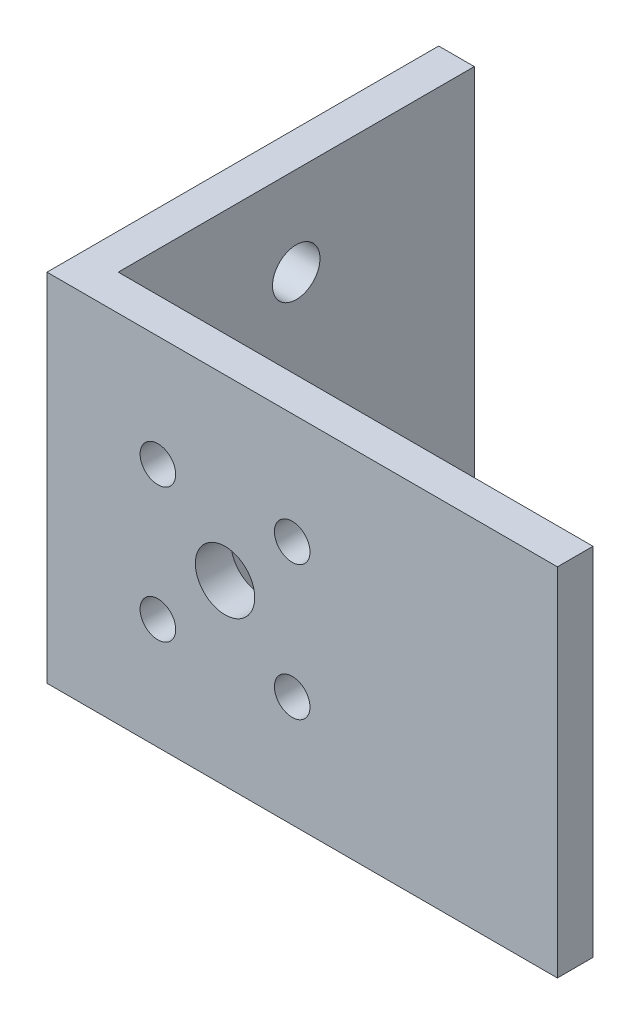
ISO-10303-21;
HEADER;
FILE_DESCRIPTION(('STEP AP214'),'2;1');
FILE_NAME('part.step','',(''),(''),'','','');
FILE_SCHEMA(('AUTOMOTIVE_DESIGN { 1 0 10303 214 1 1 1 1 }'));
ENDSEC;
DATA;
#1=APPLICATION_CONTEXT('core data for automotive mechanical design processes');
#2=APPLICATION_PROTOCOL_DEFINITION('international standard','automotive_design',2000,#1);
#3=PRODUCT_CONTEXT('',#1,'mechanical');
#4=PRODUCT('Part','Part','',(#3));
#5=PRODUCT_RELATED_PRODUCT_CATEGORY('part','',(#4));
#6=PRODUCT_DEFINITION_FORMATION('','',#4);
#7=PRODUCT_DEFINITION_CONTEXT('part definition',#1,'design');
#8=PRODUCT_DEFINITION('design','',#6,#7);
#9=PRODUCT_DEFINITION_SHAPE('','',#8);
#10=(LENGTH_UNIT() NAMED_UNIT(*) SI_UNIT(.MILLI.,.METRE.));
#11=(NAMED_UNIT(*) PLANE_ANGLE_UNIT() SI_UNIT($,.RADIAN.));
#12=(NAMED_UNIT(*) SI_UNIT($,.STERADIAN.) SOLID_ANGLE_UNIT());
#13=UNCERTAINTY_MEASURE_WITH_UNIT(LENGTH_MEASURE(1.E-05),#10,'distance_accuracy_value','');
#14=(GEOMETRIC_REPRESENTATION_CONTEXT(3) GLOBAL_UNCERTAINTY_ASSIGNED_CONTEXT((#13)) GLOBAL_UNIT_ASSIGNED_CONTEXT((#10,
#11,#12)) REPRESENTATION_CONTEXT('',''));
#15=CARTESIAN_POINT('',(0.,0.,0.));
#16=DIRECTION('',(0.,0.,1.));
#17=DIRECTION('',(1.,0.,0.));
#18=AXIS2_PLACEMENT_3D('',#15,#16,#17);
#19=CARTESIAN_POINT('',(0.,30.,-33.));
#20=DIRECTION('',(1.,0.,0.));
#21=DIRECTION('',(0.,0.,-1.));
#22=AXIS2_PLACEMENT_3D('',#19,#20,#21);
#23=PLANE('',#22);
#24=CARTESIAN_POINT('',(0.,22.5,-18.));
#25=DIRECTION('',(-1.,0.,0.));
#26=DIRECTION('',(0.,0.,1.));
#27=AXIS2_PLACEMENT_3D('',#24,#25,#26);
#28=CIRCLE('',#27,2.);
#29=CARTESIAN_POINT('',(0.,22.5,-16.));
#30=VERTEX_POINT('',#29);
#31=EDGE_CURVE('E164',#30,#30,#28,.T.);
#32=ORIENTED_EDGE('',*,*,#31,.F.);
#33=EDGE_LOOP('',(#32));
#34=FACE_BOUND('',#33,.T.);
#35=CARTESIAN_POINT('',(0.,7.5,-18.));
#36=DIRECTION('',(-1.,0.,0.));
#37=DIRECTION('',(0.,0.,1.));
#38=AXIS2_PLACEMENT_3D('',#35,#36,#37);
#39=CIRCLE('',#38,2.);
#40=CARTESIAN_POINT('',(0.,7.5,-16.));
#41=VERTEX_POINT('',#40);
#42=EDGE_CURVE('E167',#41,#41,#39,.T.);
#43=ORIENTED_EDGE('',*,*,#42,.F.);
#44=EDGE_LOOP('',(#43));
#45=FACE_BOUND('',#44,.T.);
#46=DIRECTION('',(0.,0.,1.));
#47=VECTOR('',#46,1.);
#48=CARTESIAN_POINT('',(0.,0.,-33.));
#49=LINE('',#48,#47);
#50=CARTESIAN_POINT('',(0.,0.,-33.));
#51=VERTEX_POINT('',#50);
#52=CARTESIAN_POINT('',(0.,0.,0.));
#53=VERTEX_POINT('',#52);
#54=EDGE_CURVE('E119',#51,#53,#49,.T.);
#55=ORIENTED_EDGE('',*,*,#54,.T.);
#56=DIRECTION('',(0.,-1.,0.));
#57=VECTOR('',#56,1.);
#58=CARTESIAN_POINT('',(0.,30.,0.));
#59=LINE('',#58,#57);
#60=CARTESIAN_POINT('',(0.,30.,0.));
#61=VERTEX_POINT('',#60);
#62=EDGE_CURVE('E11',#61,#53,#59,.T.);
#63=ORIENTED_EDGE('',*,*,#62,.F.);
#64=DIRECTION('',(0.,0.,1.));
#65=VECTOR('',#64,1.);
#66=CARTESIAN_POINT('',(0.,30.,-33.));
#67=LINE('',#66,#65);
#68=CARTESIAN_POINT('',(0.,30.,-33.));
#69=VERTEX_POINT('',#68);
#70=EDGE_CURVE('E130',#69,#61,#67,.T.);
#71=ORIENTED_EDGE('',*,*,#70,.F.);
#72=DIRECTION('',(0.,-1.,0.));
#73=VECTOR('',#72,1.);
#74=CARTESIAN_POINT('',(0.,30.,-33.));
#75=LINE('',#74,#73);
#76=EDGE_CURVE('E115',#69,#51,#75,.T.);
#77=ORIENTED_EDGE('',*,*,#76,.T.);
#78=EDGE_LOOP('',(#55,#63,#71,#77));
#79=FACE_BOUND('',#78,.T.);
#80=ADVANCED_FACE('F35',(#34,#45,#79),#23,.F.);
#81=CARTESIAN_POINT('',(0.,30.,0.));
#82=DIRECTION('',(0.,0.,-1.));
#83=DIRECTION('',(-1.,0.,0.));
#84=AXIS2_PLACEMENT_3D('',#81,#82,#83);
#85=PLANE('',#84);
#86=CARTESIAN_POINT('',(9.34314575050763,20.6568542494924,0.));
#87=DIRECTION('',(0.,0.,-1.));
#88=DIRECTION('',(-1.,0.,0.));
#89=AXIS2_PLACEMENT_3D('',#86,#87,#88);
#90=CIRCLE('',#89,1.5);
#91=CARTESIAN_POINT('',(7.84314575050762,20.6568542494924,0.));
#92=VERTEX_POINT('',#91);
#93=EDGE_CURVE('E203',#92,#92,#90,.F.);
#94=ORIENTED_EDGE('',*,*,#93,.F.);
#95=EDGE_LOOP('',(#94));
#96=FACE_BOUND('',#95,.T.);
#97=CARTESIAN_POINT('',(20.6568542494924,20.6568542494924,0.));
#98=DIRECTION('',(0.,0.,-1.));
#99=DIRECTION('',(-1.,0.,0.));
#100=AXIS2_PLACEMENT_3D('',#97,#98,#99);
#101=CIRCLE('',#100,1.50000000000001);
#102=CARTESIAN_POINT('',(19.1568542494924,20.6568542494924,0.));
#103=VERTEX_POINT('',#102);
#104=EDGE_CURVE('E197',#103,#103,#101,.F.);
#105=ORIENTED_EDGE('',*,*,#104,.F.);
#106=EDGE_LOOP('',(#105));
#107=FACE_BOUND('',#106,.T.);
#108=CARTESIAN_POINT('',(9.3431457505076,9.34314575050764,0.));
#109=DIRECTION('',(0.,0.,-1.));
#110=DIRECTION('',(-1.,0.,0.));
#111=AXIS2_PLACEMENT_3D('',#108,#109,#110);
#112=CIRCLE('',#111,1.5);
#113=CARTESIAN_POINT('',(7.8431457505076,9.34314575050764,0.));
#114=VERTEX_POINT('',#113);
#115=EDGE_CURVE('E191',#114,#114,#112,.F.);
#116=ORIENTED_EDGE('',*,*,#115,.F.);
#117=EDGE_LOOP('',(#116));
#118=FACE_BOUND('',#117,.T.);
#119=CARTESIAN_POINT('',(20.6568542494924,9.34314575050761,0.));
#120=DIRECTION('',(0.,0.,-1.));
#121=DIRECTION('',(-1.,0.,0.));
#122=AXIS2_PLACEMENT_3D('',#119,#120,#121);
#123=CIRCLE('',#122,1.50000000000001);
#124=CARTESIAN_POINT('',(19.1568542494924,9.34314575050761,0.));
#125=VERTEX_POINT('',#124);
#126=EDGE_CURVE('E185',#125,#125,#123,.F.);
#127=ORIENTED_EDGE('',*,*,#126,.F.);
#128=EDGE_LOOP('',(#127));
#129=FACE_BOUND('',#128,.T.);
#130=CARTESIAN_POINT('',(15.,15.,0.));
#131=DIRECTION('',(0.,0.,-1.));
#132=DIRECTION('',(-1.,0.,0.));
#133=AXIS2_PLACEMENT_3D('',#130,#131,#132);
#134=CIRCLE('',#133,2.5);
#135=CARTESIAN_POINT('',(12.5,15.,0.));
#136=VERTEX_POINT('',#135);
#137=EDGE_CURVE('E179',#136,#136,#134,.F.);
#138=ORIENTED_EDGE('',*,*,#137,.F.);
#139=EDGE_LOOP('',(#138));
#140=FACE_BOUND('',#139,.T.);
#141=DIRECTION('',(1.,0.,0.));
#142=VECTOR('',#141,1.);
#143=CARTESIAN_POINT('',(0.,0.,0.));
#144=LINE('',#143,#142);
#145=CARTESIAN_POINT('',(43.,0.,0.));
#146=VERTEX_POINT('',#145);
#147=EDGE_CURVE('E122',#53,#146,#144,.T.);
#148=ORIENTED_EDGE('',*,*,#147,.T.);
#149=DIRECTION('',(0.,-1.,0.));
#150=VECTOR('',#149,1.);
#151=CARTESIAN_POINT('',(43.,30.,0.));
#152=LINE('',#151,#150);
#153=CARTESIAN_POINT('',(43.,30.,0.));
#154=VERTEX_POINT('',#153);
#155=EDGE_CURVE('E43',#154,#146,#152,.T.);
#156=ORIENTED_EDGE('',*,*,#155,.F.);
#157=DIRECTION('',(1.,0.,0.));
#158=VECTOR('',#157,1.);
#159=CARTESIAN_POINT('',(0.,30.,0.));
#160=LINE('',#159,#158);
#161=EDGE_CURVE('E88',#61,#154,#160,.T.);
#162=ORIENTED_EDGE('',*,*,#161,.F.);
#163=ORIENTED_EDGE('',*,*,#62,.T.);
#164=EDGE_LOOP('',(#148,#156,#162,#163));
#165=FACE_BOUND('',#164,.T.);
#166=ADVANCED_FACE('F155',(#96,#107,#118,#129,#140,#165),#85,.F.);
#167=CARTESIAN_POINT('',(43.,30.,0.));
#168=DIRECTION('',(-1.,0.,0.));
#169=DIRECTION('',(0.,0.,1.));
#170=AXIS2_PLACEMENT_3D('',#167,#168,#169);
#171=PLANE('',#170);
#172=DIRECTION('',(0.,0.,-1.));
#173=VECTOR('',#172,1.);
#174=CARTESIAN_POINT('',(43.,0.,0.));
#175=LINE('',#174,#173);
#176=CARTESIAN_POINT('',(43.,0.,-2.99999999999999));
#177=VERTEX_POINT('',#176);
#178=EDGE_CURVE('E125',#146,#177,#175,.T.);
#179=ORIENTED_EDGE('',*,*,#178,.T.);
#180=DIRECTION('',(0.,-1.,0.));
#181=VECTOR('',#180,1.);
#182=CARTESIAN_POINT('',(43.,30.,-2.99999999999999));
#183=LINE('',#182,#181);
#184=CARTESIAN_POINT('',(43.,30.,-2.99999999999999));
#185=VERTEX_POINT('',#184);
#186=EDGE_CURVE('E110',#185,#177,#183,.T.);
#187=ORIENTED_EDGE('',*,*,#186,.F.);
#188=DIRECTION('',(0.,0.,-1.));
#189=VECTOR('',#188,1.);
#190=CARTESIAN_POINT('',(43.,30.,0.));
#191=LINE('',#190,#189);
#192=EDGE_CURVE('E101',#154,#185,#191,.T.);
#193=ORIENTED_EDGE('',*,*,#192,.F.);
#194=ORIENTED_EDGE('',*,*,#155,.T.);
#195=EDGE_LOOP('',(#179,#187,#193,#194));
#196=FACE_BOUND('',#195,.T.);
#197=ADVANCED_FACE('F136',(#196),#171,.F.);
#198=CARTESIAN_POINT('',(43.,30.,-2.99999999999999));
#199=DIRECTION('',(0.,0.,1.));
#200=DIRECTION('',(1.,0.,0.));
#201=AXIS2_PLACEMENT_3D('',#198,#199,#200);
#202=PLANE('',#201);
#203=CARTESIAN_POINT('',(9.34314575050763,20.6568542494924,-2.99999999999999));
#204=DIRECTION('',(0.,0.,-1.));
#205=DIRECTION('',(-1.,0.,0.));
#206=AXIS2_PLACEMENT_3D('',#203,#204,#205);
#207=CIRCLE('',#206,1.5);
#208=CARTESIAN_POINT('',(7.84314575050762,20.6568542494924,-2.99999999999999));
#209=VERTEX_POINT('',#208);
#210=EDGE_CURVE('E206',#209,#209,#207,.T.);
#211=ORIENTED_EDGE('',*,*,#210,.F.);
#212=EDGE_LOOP('',(#211));
#213=FACE_BOUND('',#212,.T.);
#214=CARTESIAN_POINT('',(20.6568542494924,20.6568542494924,-2.99999999999999));
#215=DIRECTION('',(0.,0.,-1.));
#216=DIRECTION('',(-1.,0.,0.));
#217=AXIS2_PLACEMENT_3D('',#214,#215,#216);
#218=CIRCLE('',#217,1.50000000000001);
#219=CARTESIAN_POINT('',(19.1568542494924,20.6568542494924,-2.99999999999999));
#220=VERTEX_POINT('',#219);
#221=EDGE_CURVE('E200',#220,#220,#218,.T.);
#222=ORIENTED_EDGE('',*,*,#221,.F.);
#223=EDGE_LOOP('',(#222));
#224=FACE_BOUND('',#223,.T.);
#225=CARTESIAN_POINT('',(9.3431457505076,9.34314575050764,-2.99999999999999));
#226=DIRECTION('',(0.,0.,-1.));
#227=DIRECTION('',(-1.,0.,0.));
#228=AXIS2_PLACEMENT_3D('',#225,#226,#227);
#229=CIRCLE('',#228,1.5);
#230=CARTESIAN_POINT('',(7.8431457505076,9.34314575050764,-2.99999999999999));
#231=VERTEX_POINT('',#230);
#232=EDGE_CURVE('E194',#231,#231,#229,.T.);
#233=ORIENTED_EDGE('',*,*,#232,.F.);
#234=EDGE_LOOP('',(#233));
#235=FACE_BOUND('',#234,.T.);
#236=CARTESIAN_POINT('',(20.6568542494924,9.34314575050761,-2.99999999999999));
#237=DIRECTION('',(0.,0.,-1.));
#238=DIRECTION('',(-1.,0.,0.));
#239=AXIS2_PLACEMENT_3D('',#236,#237,#238);
#240=CIRCLE('',#239,1.50000000000001);
#241=CARTESIAN_POINT('',(19.1568542494924,9.34314575050761,-2.99999999999999));
#242=VERTEX_POINT('',#241);
#243=EDGE_CURVE('E188',#242,#242,#240,.T.);
#244=ORIENTED_EDGE('',*,*,#243,.F.);
#245=EDGE_LOOP('',(#244));
#246=FACE_BOUND('',#245,.T.);
#247=CARTESIAN_POINT('',(15.,15.,-2.99999999999999));
#248=DIRECTION('',(0.,0.,-1.));
#249=DIRECTION('',(-1.,0.,0.));
#250=AXIS2_PLACEMENT_3D('',#247,#248,#249);
#251=CIRCLE('',#250,2.5);
#252=CARTESIAN_POINT('',(12.5,15.,-2.99999999999999));
#253=VERTEX_POINT('',#252);
#254=EDGE_CURVE('E182',#253,#253,#251,.T.);
#255=ORIENTED_EDGE('',*,*,#254,.F.);
#256=EDGE_LOOP('',(#255));
#257=FACE_BOUND('',#256,.T.);
#258=DIRECTION('',(-1.,0.,0.));
#259=VECTOR('',#258,1.);
#260=CARTESIAN_POINT('',(43.,0.,-2.99999999999999));
#261=LINE('',#260,#259);
#262=CARTESIAN_POINT('',(3.,0.,-2.99999999999999));
#263=VERTEX_POINT('',#262);
#264=EDGE_CURVE('E109',#177,#263,#261,.T.);
#265=ORIENTED_EDGE('',*,*,#264,.T.);
#266=DIRECTION('',(0.,-1.,0.));
#267=VECTOR('',#266,1.);
#268=CARTESIAN_POINT('',(3.,30.,-2.99999999999999));
#269=LINE('',#268,#267);
#270=CARTESIAN_POINT('',(3.,30.,-2.99999999999999));
#271=VERTEX_POINT('',#270);
#272=EDGE_CURVE('E106',#271,#263,#269,.T.);
#273=ORIENTED_EDGE('',*,*,#272,.F.);
#274=DIRECTION('',(-1.,0.,0.));
#275=VECTOR('',#274,1.);
#276=CARTESIAN_POINT('',(43.,30.,-2.99999999999999));
#277=LINE('',#276,#275);
#278=EDGE_CURVE('E95',#185,#271,#277,.T.);
#279=ORIENTED_EDGE('',*,*,#278,.F.);
#280=ORIENTED_EDGE('',*,*,#186,.T.);
#281=EDGE_LOOP('',(#265,#273,#279,#280));
#282=FACE_BOUND('',#281,.T.);
#283=ADVANCED_FACE('F107',(#213,#224,#235,#246,#257,#282),#202,.F.);
#284=CARTESIAN_POINT('',(3.,30.,-2.99999999999999));
#285=DIRECTION('',(-1.,0.,0.));
#286=DIRECTION('',(0.,0.,1.));
#287=AXIS2_PLACEMENT_3D('',#284,#285,#286);
#288=PLANE('',#287);
#289=CARTESIAN_POINT('',(2.99999999999999,22.5,-18.));
#290=DIRECTION('',(-1.,0.,0.));
#291=DIRECTION('',(0.,0.,1.));
#292=AXIS2_PLACEMENT_3D('',#289,#290,#291);
#293=CIRCLE('',#292,2.);
#294=CARTESIAN_POINT('',(2.99999999999999,22.5,-16.));
#295=VERTEX_POINT('',#294);
#296=EDGE_CURVE('E169',#295,#295,#293,.F.);
#297=ORIENTED_EDGE('',*,*,#296,.F.);
#298=EDGE_LOOP('',(#297));
#299=FACE_BOUND('',#298,.T.);
#300=CARTESIAN_POINT('',(2.99999999999999,7.5,-18.));
#301=DIRECTION('',(-1.,0.,0.));
#302=DIRECTION('',(0.,0.,1.));
#303=AXIS2_PLACEMENT_3D('',#300,#301,#302);
#304=CIRCLE('',#303,2.);
#305=CARTESIAN_POINT('',(2.99999999999999,7.5,-16.));
#306=VERTEX_POINT('',#305);
#307=EDGE_CURVE('E123',#306,#306,#304,.F.);
#308=ORIENTED_EDGE('',*,*,#307,.F.);
#309=EDGE_LOOP('',(#308));
#310=FACE_BOUND('',#309,.T.);
#311=DIRECTION('',(0.,0.,-1.));
#312=VECTOR('',#311,1.);
#313=CARTESIAN_POINT('',(3.,0.,-2.99999999999999));
#314=LINE('',#313,#312);
#315=CARTESIAN_POINT('',(2.99999999999999,0.,-33.));
#316=VERTEX_POINT('',#315);
#317=EDGE_CURVE('E74',#263,#316,#314,.T.);
#318=ORIENTED_EDGE('',*,*,#317,.T.);
#319=DIRECTION('',(0.,-1.,0.));
#320=VECTOR('',#319,1.);
#321=CARTESIAN_POINT('',(2.99999999999999,30.,-33.));
#322=LINE('',#321,#320);
#323=CARTESIAN_POINT('',(2.99999999999999,30.,-33.));
#324=VERTEX_POINT('',#323);
#325=EDGE_CURVE('E111',#324,#316,#322,.T.);
#326=ORIENTED_EDGE('',*,*,#325,.F.);
#327=DIRECTION('',(0.,0.,-1.));
#328=VECTOR('',#327,1.);
#329=CARTESIAN_POINT('',(3.,30.,-2.99999999999999));
#330=LINE('',#329,#328);
#331=EDGE_CURVE('E99',#271,#324,#330,.T.);
#332=ORIENTED_EDGE('',*,*,#331,.F.);
#333=ORIENTED_EDGE('',*,*,#272,.T.);
#334=EDGE_LOOP('',(#318,#326,#332,#333));
#335=FACE_BOUND('',#334,.T.);
#336=ADVANCED_FACE('F113',(#299,#310,#335),#288,.F.);
#337=CARTESIAN_POINT('',(2.99999999999999,30.,-33.));
#338=DIRECTION('',(0.,0.,1.));
#339=DIRECTION('',(1.,0.,0.));
#340=AXIS2_PLACEMENT_3D('',#337,#338,#339);
#341=PLANE('',#340);
#342=DIRECTION('',(-1.,0.,0.));
#343=VECTOR('',#342,1.);
#344=CARTESIAN_POINT('',(2.99999999999999,0.,-33.));
#345=LINE('',#344,#343);
#346=EDGE_CURVE('E80',#316,#51,#345,.T.);
#347=ORIENTED_EDGE('',*,*,#346,.T.);
#348=ORIENTED_EDGE('',*,*,#76,.F.);
#349=DIRECTION('',(-1.,0.,0.));
#350=VECTOR('',#349,1.);
#351=CARTESIAN_POINT('',(2.99999999999999,30.,-33.));
#352=LINE('',#351,#350);
#353=EDGE_CURVE('E51',#324,#69,#352,.T.);
#354=ORIENTED_EDGE('',*,*,#353,.F.);
#355=ORIENTED_EDGE('',*,*,#325,.T.);
#356=EDGE_LOOP('',(#347,#348,#354,#355));
#357=FACE_BOUND('',#356,.T.);
#358=ADVANCED_FACE('F143',(#357),#341,.F.);
#359=CARTESIAN_POINT('',(0.,30.,0.));
#360=DIRECTION('',(0.,1.,0.));
#361=DIRECTION('',(0.,0.,1.));
#362=AXIS2_PLACEMENT_3D('',#359,#360,#361);
#363=PLANE('',#362);
#364=ORIENTED_EDGE('',*,*,#70,.T.);
#365=ORIENTED_EDGE('',*,*,#161,.T.);
#366=ORIENTED_EDGE('',*,*,#192,.T.);
#367=ORIENTED_EDGE('',*,*,#278,.T.);
#368=ORIENTED_EDGE('',*,*,#331,.T.);
#369=ORIENTED_EDGE('',*,*,#353,.T.);
#370=EDGE_LOOP('',(#364,#365,#366,#367,#368,#369));
#371=FACE_BOUND('',#370,.T.);
#372=ADVANCED_FACE('F97',(#371),#363,.T.);
#373=CARTESIAN_POINT('',(0.,0.,0.));
#374=DIRECTION('',(0.,1.,0.));
#375=DIRECTION('',(0.,0.,1.));
#376=AXIS2_PLACEMENT_3D('',#373,#374,#375);
#377=PLANE('',#376);
#378=ORIENTED_EDGE('',*,*,#54,.F.);
#379=ORIENTED_EDGE('',*,*,#346,.F.);
#380=ORIENTED_EDGE('',*,*,#317,.F.);
#381=ORIENTED_EDGE('',*,*,#264,.F.);
#382=ORIENTED_EDGE('',*,*,#178,.F.);
#383=ORIENTED_EDGE('',*,*,#147,.F.);
#384=EDGE_LOOP('',(#378,#379,#380,#381,#382,#383));
#385=FACE_BOUND('',#384,.T.);
#386=ADVANCED_FACE('F139',(#385),#377,.F.);
#387=CARTESIAN_POINT('',(43.001,7.5,-18.));
#388=DIRECTION('',(-1.,0.,0.));
#389=DIRECTION('',(0.,0.,1.));
#390=AXIS2_PLACEMENT_3D('',#387,#388,#389);
#391=CYLINDRICAL_SURFACE('',#390,2.);
#392=ORIENTED_EDGE('',*,*,#42,.T.);
#393=EDGE_LOOP('',(#392));
#394=FACE_BOUND('',#393,.T.);
#395=ORIENTED_EDGE('',*,*,#307,.T.);
#396=EDGE_LOOP('',(#395));
#397=FACE_BOUND('',#396,.T.);
#398=ADVANCED_FACE('F239',(#394,#397),#391,.F.);
#399=CARTESIAN_POINT('',(43.001,22.5,-18.));
#400=DIRECTION('',(-1.,0.,0.));
#401=DIRECTION('',(0.,0.,1.));
#402=AXIS2_PLACEMENT_3D('',#399,#400,#401);
#403=CYLINDRICAL_SURFACE('',#402,2.);
#404=ORIENTED_EDGE('',*,*,#31,.T.);
#405=EDGE_LOOP('',(#404));
#406=FACE_BOUND('',#405,.T.);
#407=ORIENTED_EDGE('',*,*,#296,.T.);
#408=EDGE_LOOP('',(#407));
#409=FACE_BOUND('',#408,.T.);
#410=ADVANCED_FACE('F228',(#406,#409),#403,.F.);
#411=CARTESIAN_POINT('',(15.,15.,0.00100000000000404));
#412=DIRECTION('',(0.,0.,-1.));
#413=DIRECTION('',(-1.,0.,0.));
#414=AXIS2_PLACEMENT_3D('',#411,#412,#413);
#415=CYLINDRICAL_SURFACE('',#414,2.5);
#416=CARTESIAN_POINT('',(12.5,15.,-2.99999999999999));
#417=CARTESIAN_POINT('',(12.5,15.,-2.96874999999999));
#418=CARTESIAN_POINT('',(12.5,15.,-2.93749999999999));
#419=CARTESIAN_POINT('',(12.5,15.,-2.87499999999999));
#420=CARTESIAN_POINT('',(12.5,15.,-2.84374999999999));
#421=CARTESIAN_POINT('',(12.5,15.,-2.78124999999999));
#422=CARTESIAN_POINT('',(12.5,15.,-2.74999999999999));
#423=CARTESIAN_POINT('',(12.5,15.,-2.68749999999999));
#424=CARTESIAN_POINT('',(12.5,15.,-2.65624999999999));
#425=CARTESIAN_POINT('',(12.5,15.,-2.59374999999999));
#426=CARTESIAN_POINT('',(12.5,15.,-2.56249999999999));
#427=CARTESIAN_POINT('',(12.5,15.,-2.49999999999999));
#428=CARTESIAN_POINT('',(12.5,15.,-2.46874999999999));
#429=CARTESIAN_POINT('',(12.5,15.,-2.40624999999999));
#430=CARTESIAN_POINT('',(12.5,15.,-2.37499999999999));
#431=CARTESIAN_POINT('',(12.5,15.,-2.31249999999999));
#432=CARTESIAN_POINT('',(12.5,15.,-2.28124999999999));
#433=CARTESIAN_POINT('',(12.5,15.,-2.21874999999999));
#434=CARTESIAN_POINT('',(12.5,15.,-2.18749999999999));
#435=CARTESIAN_POINT('',(12.5,15.,-2.12499999999999));
#436=CARTESIAN_POINT('',(12.5,15.,-2.09374999999999));
#437=CARTESIAN_POINT('',(12.5,15.,-2.03124999999999));
#438=CARTESIAN_POINT('',(12.5,15.,-1.99999999999999));
#439=CARTESIAN_POINT('',(12.5,15.,-1.93749999999999));
#440=CARTESIAN_POINT('',(12.5,15.,-1.90624999999999));
#441=CARTESIAN_POINT('',(12.5,15.,-1.84374999999999));
#442=CARTESIAN_POINT('',(12.5,15.,-1.81249999999999));
#443=CARTESIAN_POINT('',(12.5,15.,-1.74999999999999));
#444=CARTESIAN_POINT('',(12.5,15.,-1.71874999999999));
#445=CARTESIAN_POINT('',(12.5,15.,-1.65624999999999));
#446=CARTESIAN_POINT('',(12.5,15.,-1.62499999999999));
#447=CARTESIAN_POINT('',(12.5,15.,-1.56249999999999));
#448=CARTESIAN_POINT('',(12.5,15.,-1.53124999999999));
#449=CARTESIAN_POINT('',(12.5,15.,-1.46875));
#450=CARTESIAN_POINT('',(12.5,15.,-1.4375));
#451=CARTESIAN_POINT('',(12.5,15.,-1.375));
#452=CARTESIAN_POINT('',(12.5,15.,-1.34375));
#453=CARTESIAN_POINT('',(12.5,15.,-1.28125));
#454=CARTESIAN_POINT('',(12.5,15.,-1.25));
#455=CARTESIAN_POINT('',(12.5,15.,-1.1875));
#456=CARTESIAN_POINT('',(12.5,15.,-1.15625));
#457=CARTESIAN_POINT('',(12.5,15.,-1.09375));
#458=CARTESIAN_POINT('',(12.5,15.,-1.0625));
#459=CARTESIAN_POINT('',(12.5,15.,-0.999999999999997));
#460=CARTESIAN_POINT('',(12.5,15.,-0.968749999999997));
#461=CARTESIAN_POINT('',(12.5,15.,-0.906249999999997));
#462=CARTESIAN_POINT('',(12.5,15.,-0.874999999999997));
#463=CARTESIAN_POINT('',(12.5,15.,-0.812499999999997));
#464=CARTESIAN_POINT('',(12.5,15.,-0.781249999999998));
#465=CARTESIAN_POINT('',(12.5,15.,-0.718749999999998));
#466=CARTESIAN_POINT('',(12.5,15.,-0.687499999999998));
#467=CARTESIAN_POINT('',(12.5,15.,-0.624999999999998));
#468=CARTESIAN_POINT('',(12.5,15.,-0.593749999999998));
#469=CARTESIAN_POINT('',(12.5,15.,-0.531249999999998));
#470=CARTESIAN_POINT('',(12.5,15.,-0.499999999999999));
#471=CARTESIAN_POINT('',(12.5,15.,-0.437499999999999));
#472=CARTESIAN_POINT('',(12.5,15.,-0.406249999999999));
#473=CARTESIAN_POINT('',(12.5,15.,-0.343749999999999));
#474=CARTESIAN_POINT('',(12.5,15.,-0.312499999999999));
#475=CARTESIAN_POINT('',(12.5,15.,-0.249999999999999));
#476=CARTESIAN_POINT('',(12.5,15.,-0.218749999999999));
#477=CARTESIAN_POINT('',(12.5,15.,-0.15625));
#478=CARTESIAN_POINT('',(12.5,15.,-0.125));
#479=CARTESIAN_POINT('',(12.5,15.,-0.0624999999999998));
#480=CARTESIAN_POINT('',(12.5,15.,-0.03125));
#481=CARTESIAN_POINT('',(12.5,15.,0.));
#482=B_SPLINE_CURVE_WITH_KNOTS('',3,(#416,#417,#418,#419,#420,#421,#422,#423,#424,#425,#426,
#427,#428,#429,#430,#431,#432,#433,#434,#435,#436,#437,#438,#439,#440,#441,#442,#443,#444,#445,
#446,#447,#448,#449,#450,#451,#452,#453,#454,#455,#456,#457,#458,#459,#460,#461,#462,#463,#464,
#465,#466,#467,#468,#469,#470,#471,#472,#473,#474,#475,#476,#477,#478,#479,#480,#481),
.UNSPECIFIED.,.F.,.F.,(4,2,2,2,2,2,2,2,2,2,2,2,2,2,2,2,2,2,2,2,2,2,2,2,2,2,2,2,2,2,2,2,4),(0.,
0.0937499999999997,0.187499999999999,0.281249999999999,0.374999999999999,0.468749999999999,
0.562499999999998,0.656249999999998,0.749999999999998,0.843749999999997,0.937499999999997,
1.03125,1.125,1.21875,1.3125,1.40625,1.5,1.59374999999999,1.68749999999999,1.78124999999999,
1.87499999999999,1.96874999999999,2.06249999999999,2.15624999999999,2.24999999999999,
2.34374999999999,2.43749999999999,2.53124999999999,2.62499999999999,2.71874999999999,
2.81249999999999,2.90624999999999,2.99999999999999),.UNSPECIFIED.);
#483=EDGE_CURVE('BSEAM224',#253,#136,#482,.T.);
#484=ORIENTED_EDGE('',*,*,#254,.T.);
#485=ORIENTED_EDGE('',*,*,#137,.T.);
#486=ORIENTED_EDGE('',*,*,#483,.T.);
#487=ORIENTED_EDGE('',*,*,#483,.F.);
#488=EDGE_LOOP('',(#484,#486,#485,#487));
#489=FACE_BOUND('',#488,.T.);
#490=ADVANCED_FACE('F224',(#489),#415,.F.);
#491=CARTESIAN_POINT('',(20.6568542494924,9.34314575050761,0.00100000000000317));
#492=DIRECTION('',(0.,0.,-1.));
#493=DIRECTION('',(-1.,0.,0.));
#494=AXIS2_PLACEMENT_3D('',#491,#492,#493);
#495=CYLINDRICAL_SURFACE('',#494,1.50000000000001);
#496=CARTESIAN_POINT('',(19.1568542494924,9.34314575050761,-2.99999999999999));
#497=CARTESIAN_POINT('',(19.1568542494924,9.34314575050761,-2.96874999999999));
#498=CARTESIAN_POINT('',(19.1568542494924,9.34314575050761,-2.93749999999999));
#499=CARTESIAN_POINT('',(19.1568542494924,9.34314575050761,-2.87499999999999));
#500=CARTESIAN_POINT('',(19.1568542494924,9.34314575050761,-2.84374999999999));
#501=CARTESIAN_POINT('',(19.1568542494924,9.34314575050761,-2.78124999999999));
#502=CARTESIAN_POINT('',(19.1568542494924,9.34314575050761,-2.74999999999999));
#503=CARTESIAN_POINT('',(19.1568542494924,9.34314575050761,-2.68749999999999));
#504=CARTESIAN_POINT('',(19.1568542494924,9.34314575050761,-2.65624999999999));
#505=CARTESIAN_POINT('',(19.1568542494924,9.34314575050761,-2.59374999999999));
#506=CARTESIAN_POINT('',(19.1568542494924,9.34314575050761,-2.56249999999999));
#507=CARTESIAN_POINT('',(19.1568542494924,9.34314575050761,-2.49999999999999));
#508=CARTESIAN_POINT('',(19.1568542494924,9.34314575050761,-2.46874999999999));
#509=CARTESIAN_POINT('',(19.1568542494924,9.34314575050761,-2.40624999999999));
#510=CARTESIAN_POINT('',(19.1568542494924,9.34314575050761,-2.37499999999999));
#511=CARTESIAN_POINT('',(19.1568542494924,9.34314575050761,-2.31249999999999));
#512=CARTESIAN_POINT('',(19.1568542494924,9.34314575050761,-2.28124999999999));
#513=CARTESIAN_POINT('',(19.1568542494924,9.34314575050761,-2.21874999999999));
#514=CARTESIAN_POINT('',(19.1568542494924,9.34314575050761,-2.18749999999999));
#515=CARTESIAN_POINT('',(19.1568542494924,9.34314575050761,-2.12499999999999));
#516=CARTESIAN_POINT('',(19.1568542494924,9.34314575050761,-2.09374999999999));
#517=CARTESIAN_POINT('',(19.1568542494924,9.34314575050761,-2.03124999999999));
#518=CARTESIAN_POINT('',(19.1568542494924,9.34314575050761,-1.99999999999999));
#519=CARTESIAN_POINT('',(19.1568542494924,9.34314575050761,-1.93749999999999));
#520=CARTESIAN_POINT('',(19.1568542494924,9.34314575050761,-1.90624999999999));
#521=CARTESIAN_POINT('',(19.1568542494924,9.34314575050761,-1.84374999999999));
#522=CARTESIAN_POINT('',(19.1568542494924,9.34314575050761,-1.81249999999999));
#523=CARTESIAN_POINT('',(19.1568542494924,9.34314575050761,-1.74999999999999));
#524=CARTESIAN_POINT('',(19.1568542494924,9.34314575050761,-1.71874999999999));
#525=CARTESIAN_POINT('',(19.1568542494924,9.34314575050761,-1.65624999999999));
#526=CARTESIAN_POINT('',(19.1568542494924,9.34314575050761,-1.62499999999999));
#527=CARTESIAN_POINT('',(19.1568542494924,9.34314575050761,-1.56249999999999));
#528=CARTESIAN_POINT('',(19.1568542494924,9.34314575050761,-1.53124999999999));
#529=CARTESIAN_POINT('',(19.1568542494924,9.34314575050761,-1.46875));
#530=CARTESIAN_POINT('',(19.1568542494924,9.34314575050761,-1.4375));
#531=CARTESIAN_POINT('',(19.1568542494924,9.34314575050761,-1.375));
#532=CARTESIAN_POINT('',(19.1568542494924,9.34314575050761,-1.34375));
#533=CARTESIAN_POINT('',(19.1568542494924,9.34314575050761,-1.28125));
#534=CARTESIAN_POINT('',(19.1568542494924,9.34314575050761,-1.25));
#535=CARTESIAN_POINT('',(19.1568542494924,9.34314575050761,-1.1875));
#536=CARTESIAN_POINT('',(19.1568542494924,9.34314575050761,-1.15625));
#537=CARTESIAN_POINT('',(19.1568542494924,9.34314575050761,-1.09375));
#538=CARTESIAN_POINT('',(19.1568542494924,9.34314575050761,-1.0625));
#539=CARTESIAN_POINT('',(19.1568542494924,9.34314575050761,-0.999999999999997));
#540=CARTESIAN_POINT('',(19.1568542494924,9.34314575050761,-0.968749999999997));
#541=CARTESIAN_POINT('',(19.1568542494924,9.34314575050761,-0.906249999999997));
#542=CARTESIAN_POINT('',(19.1568542494924,9.34314575050761,-0.874999999999997));
#543=CARTESIAN_POINT('',(19.1568542494924,9.34314575050761,-0.812499999999997));
#544=CARTESIAN_POINT('',(19.1568542494924,9.34314575050761,-0.781249999999997));
#545=CARTESIAN_POINT('',(19.1568542494924,9.34314575050761,-0.718749999999997));
#546=CARTESIAN_POINT('',(19.1568542494924,9.34314575050761,-0.687499999999998));
#547=CARTESIAN_POINT('',(19.1568542494924,9.34314575050761,-0.624999999999998));
#548=CARTESIAN_POINT('',(19.1568542494924,9.34314575050761,-0.593749999999998));
#549=CARTESIAN_POINT('',(19.1568542494924,9.34314575050761,-0.531249999999998));
#550=CARTESIAN_POINT('',(19.1568542494924,9.34314575050761,-0.499999999999998));
#551=CARTESIAN_POINT('',(19.1568542494924,9.34314575050761,-0.437499999999999));
#552=CARTESIAN_POINT('',(19.1568542494924,9.34314575050761,-0.406249999999999));
#553=CARTESIAN_POINT('',(19.1568542494924,9.34314575050761,-0.343749999999999));
#554=CARTESIAN_POINT('',(19.1568542494924,9.34314575050761,-0.312499999999999));
#555=CARTESIAN_POINT('',(19.1568542494924,9.34314575050761,-0.249999999999999));
#556=CARTESIAN_POINT('',(19.1568542494924,9.34314575050761,-0.218749999999999));
#557=CARTESIAN_POINT('',(19.1568542494924,9.34314575050761,-0.156249999999999));
#558=CARTESIAN_POINT('',(19.1568542494924,9.34314575050761,-0.124999999999999));
#559=CARTESIAN_POINT('',(19.1568542494924,9.34314575050761,-0.0624999999999996));
#560=CARTESIAN_POINT('',(19.1568542494924,9.34314575050761,-0.0312499999999997));
#561=CARTESIAN_POINT('',(19.1568542494924,9.34314575050761,0.));
#562=B_SPLINE_CURVE_WITH_KNOTS('',3,(#496,#497,#498,#499,#500,#501,#502,#503,#504,#505,#506,
#507,#508,#509,#510,#511,#512,#513,#514,#515,#516,#517,#518,#519,#520,#521,#522,#523,#524,#525,
#526,#527,#528,#529,#530,#531,#532,#533,#534,#535,#536,#537,#538,#539,#540,#541,#542,#543,#544,
#545,#546,#547,#548,#549,#550,#551,#552,#553,#554,#555,#556,#557,#558,#559,#560,#561),
.UNSPECIFIED.,.F.,.F.,(4,2,2,2,2,2,2,2,2,2,2,2,2,2,2,2,2,2,2,2,2,2,2,2,2,2,2,2,2,2,2,2,4),(0.,
0.0937499999999997,0.187499999999999,0.281249999999999,0.374999999999999,0.468749999999999,
0.562499999999998,0.656249999999998,0.749999999999998,0.843749999999997,0.937499999999997,
1.03125,1.125,1.21875,1.3125,1.40625,1.5,1.59375,1.68749999999999,1.78124999999999,
1.87499999999999,1.96874999999999,2.06249999999999,2.15624999999999,2.24999999999999,
2.34374999999999,2.43749999999999,2.53124999999999,2.62499999999999,2.71874999999999,
2.81249999999999,2.90624999999999,2.99999999999999),.UNSPECIFIED.);
#563=EDGE_CURVE('BSEAM227',#242,#125,#562,.T.);
#564=ORIENTED_EDGE('',*,*,#243,.T.);
#565=ORIENTED_EDGE('',*,*,#126,.T.);
#566=ORIENTED_EDGE('',*,*,#563,.T.);
#567=ORIENTED_EDGE('',*,*,#563,.F.);
#568=EDGE_LOOP('',(#564,#566,#565,#567));
#569=FACE_BOUND('',#568,.T.);
#570=ADVANCED_FACE('F227',(#569),#495,.F.);
#571=CARTESIAN_POINT('',(9.3431457505076,9.34314575050764,0.0010000000000049));
#572=DIRECTION('',(0.,0.,-1.));
#573=DIRECTION('',(-1.,0.,0.));
#574=AXIS2_PLACEMENT_3D('',#571,#572,#573);
#575=CYLINDRICAL_SURFACE('',#574,1.5);
#576=CARTESIAN_POINT('',(7.8431457505076,9.34314575050764,-2.99999999999999));
#577=CARTESIAN_POINT('',(7.8431457505076,9.34314575050764,-2.96874999999999));
#578=CARTESIAN_POINT('',(7.8431457505076,9.34314575050764,-2.93749999999999));
#579=CARTESIAN_POINT('',(7.8431457505076,9.34314575050764,-2.87499999999999));
#580=CARTESIAN_POINT('',(7.8431457505076,9.34314575050764,-2.84374999999999));
#581=CARTESIAN_POINT('',(7.8431457505076,9.34314575050764,-2.78124999999999));
#582=CARTESIAN_POINT('',(7.8431457505076,9.34314575050764,-2.74999999999999));
#583=CARTESIAN_POINT('',(7.8431457505076,9.34314575050764,-2.68749999999999));
#584=CARTESIAN_POINT('',(7.8431457505076,9.34314575050764,-2.65624999999999));
#585=CARTESIAN_POINT('',(7.8431457505076,9.34314575050764,-2.59374999999999));
#586=CARTESIAN_POINT('',(7.8431457505076,9.34314575050764,-2.56249999999999));
#587=CARTESIAN_POINT('',(7.8431457505076,9.34314575050764,-2.49999999999999));
#588=CARTESIAN_POINT('',(7.8431457505076,9.34314575050764,-2.46874999999999));
#589=CARTESIAN_POINT('',(7.8431457505076,9.34314575050764,-2.40624999999999));
#590=CARTESIAN_POINT('',(7.8431457505076,9.34314575050764,-2.37499999999999));
#591=CARTESIAN_POINT('',(7.8431457505076,9.34314575050764,-2.31249999999999));
#592=CARTESIAN_POINT('',(7.8431457505076,9.34314575050764,-2.28124999999999));
#593=CARTESIAN_POINT('',(7.8431457505076,9.34314575050764,-2.21874999999999));
#594=CARTESIAN_POINT('',(7.8431457505076,9.34314575050764,-2.18749999999999));
#595=CARTESIAN_POINT('',(7.8431457505076,9.34314575050764,-2.12499999999999));
#596=CARTESIAN_POINT('',(7.8431457505076,9.34314575050764,-2.09374999999999));
#597=CARTESIAN_POINT('',(7.8431457505076,9.34314575050764,-2.03124999999999));
#598=CARTESIAN_POINT('',(7.8431457505076,9.34314575050764,-1.99999999999999));
#599=CARTESIAN_POINT('',(7.8431457505076,9.34314575050764,-1.93749999999999));
#600=CARTESIAN_POINT('',(7.8431457505076,9.34314575050764,-1.90624999999999));
#601=CARTESIAN_POINT('',(7.8431457505076,9.34314575050764,-1.84374999999999));
#602=CARTESIAN_POINT('',(7.8431457505076,9.34314575050764,-1.81249999999999));
#603=CARTESIAN_POINT('',(7.8431457505076,9.34314575050764,-1.74999999999999));
#604=CARTESIAN_POINT('',(7.8431457505076,9.34314575050764,-1.71874999999999));
#605=CARTESIAN_POINT('',(7.8431457505076,9.34314575050764,-1.65624999999999));
#606=CARTESIAN_POINT('',(7.8431457505076,9.34314575050764,-1.62499999999999));
#607=CARTESIAN_POINT('',(7.8431457505076,9.34314575050764,-1.56249999999999));
#608=CARTESIAN_POINT('',(7.8431457505076,9.34314575050764,-1.53124999999999));
#609=CARTESIAN_POINT('',(7.8431457505076,9.34314575050764,-1.46874999999999));
#610=CARTESIAN_POINT('',(7.8431457505076,9.34314575050764,-1.43749999999999));
#611=CARTESIAN_POINT('',(7.8431457505076,9.34314575050764,-1.37499999999999));
#612=CARTESIAN_POINT('',(7.8431457505076,9.34314575050764,-1.34374999999999));
#613=CARTESIAN_POINT('',(7.8431457505076,9.34314575050764,-1.28125));
#614=CARTESIAN_POINT('',(7.8431457505076,9.34314575050764,-1.25));
#615=CARTESIAN_POINT('',(7.8431457505076,9.34314575050764,-1.1875));
#616=CARTESIAN_POINT('',(7.8431457505076,9.34314575050764,-1.15625));
#617=CARTESIAN_POINT('',(7.8431457505076,9.34314575050764,-1.09375));
#618=CARTESIAN_POINT('',(7.8431457505076,9.34314575050764,-1.0625));
#619=CARTESIAN_POINT('',(7.8431457505076,9.34314575050764,-0.999999999999996));
#620=CARTESIAN_POINT('',(7.8431457505076,9.34314575050764,-0.968749999999996));
#621=CARTESIAN_POINT('',(7.8431457505076,9.34314575050764,-0.906249999999996));
#622=CARTESIAN_POINT('',(7.8431457505076,9.34314575050764,-0.874999999999996));
#623=CARTESIAN_POINT('',(7.8431457505076,9.34314575050764,-0.812499999999997));
#624=CARTESIAN_POINT('',(7.8431457505076,9.34314575050764,-0.781249999999997));
#625=CARTESIAN_POINT('',(7.8431457505076,9.34314575050764,-0.718749999999997));
#626=CARTESIAN_POINT('',(7.8431457505076,9.34314575050764,-0.687499999999997));
#627=CARTESIAN_POINT('',(7.8431457505076,9.34314575050764,-0.624999999999997));
#628=CARTESIAN_POINT('',(7.8431457505076,9.34314575050764,-0.593749999999997));
#629=CARTESIAN_POINT('',(7.8431457505076,9.34314575050764,-0.531249999999998));
#630=CARTESIAN_POINT('',(7.8431457505076,9.34314575050764,-0.499999999999998));
#631=CARTESIAN_POINT('',(7.8431457505076,9.34314575050764,-0.437499999999998));
#632=CARTESIAN_POINT('',(7.8431457505076,9.34314575050764,-0.406249999999998));
#633=CARTESIAN_POINT('',(7.8431457505076,9.34314575050764,-0.343749999999998));
#634=CARTESIAN_POINT('',(7.8431457505076,9.34314575050764,-0.312499999999999));
#635=CARTESIAN_POINT('',(7.8431457505076,9.34314575050764,-0.249999999999999));
#636=CARTESIAN_POINT('',(7.8431457505076,9.34314575050764,-0.218749999999999));
#637=CARTESIAN_POINT('',(7.8431457505076,9.34314575050764,-0.156249999999999));
#638=CARTESIAN_POINT('',(7.8431457505076,9.34314575050764,-0.124999999999999));
#639=CARTESIAN_POINT('',(7.8431457505076,9.34314575050764,-0.0624999999999996));
#640=CARTESIAN_POINT('',(7.8431457505076,9.34314575050764,-0.0312499999999997));
#641=CARTESIAN_POINT('',(7.8431457505076,9.34314575050764,0.));
#642=B_SPLINE_CURVE_WITH_KNOTS('',3,(#576,#577,#578,#579,#580,#581,#582,#583,#584,#585,#586,
#587,#588,#589,#590,#591,#592,#593,#594,#595,#596,#597,#598,#599,#600,#601,#602,#603,#604,#605,
#606,#607,#608,#609,#610,#611,#612,#613,#614,#615,#616,#617,#618,#619,#620,#621,#622,#623,#624,
#625,#626,#627,#628,#629,#630,#631,#632,#633,#634,#635,#636,#637,#638,#639,#640,#641),
.UNSPECIFIED.,.F.,.F.,(4,2,2,2,2,2,2,2,2,2,2,2,2,2,2,2,2,2,2,2,2,2,2,2,2,2,2,2,2,2,2,2,4),(0.,
0.0937499999999997,0.187499999999999,0.281249999999999,0.374999999999999,0.468749999999998,
0.562499999999998,0.656249999999998,0.749999999999997,0.843749999999997,0.937499999999996,
1.03125,1.125,1.21875,1.3125,1.40624999999999,1.49999999999999,1.59374999999999,
1.68749999999999,1.78124999999999,1.87499999999999,1.96874999999999,2.06249999999999,
2.15624999999999,2.24999999999999,2.34374999999999,2.43749999999999,2.53124999999999,
2.62499999999999,2.71874999999999,2.81249999999999,2.90624999999999,2.99999999999999),.UNSPECIFIED.);
#643=EDGE_CURVE('BSEAM236',#231,#114,#642,.T.);
#644=ORIENTED_EDGE('',*,*,#232,.T.);
#645=ORIENTED_EDGE('',*,*,#115,.T.);
#646=ORIENTED_EDGE('',*,*,#643,.T.);
#647=ORIENTED_EDGE('',*,*,#643,.F.);
#648=EDGE_LOOP('',(#644,#646,#645,#647));
#649=FACE_BOUND('',#648,.T.);
#650=ADVANCED_FACE('F236',(#649),#575,.F.);
#651=CARTESIAN_POINT('',(20.6568542494924,20.6568542494924,0.00100000000000317));
#652=DIRECTION('',(0.,0.,-1.));
#653=DIRECTION('',(-1.,0.,0.));
#654=AXIS2_PLACEMENT_3D('',#651,#652,#653);
#655=CYLINDRICAL_SURFACE('',#654,1.50000000000001);
#656=CARTESIAN_POINT('',(19.1568542494924,20.6568542494924,-2.99999999999999));
#657=CARTESIAN_POINT('',(19.1568542494924,20.6568542494924,-2.96874999999999));
#658=CARTESIAN_POINT('',(19.1568542494924,20.6568542494924,-2.93749999999999));
#659=CARTESIAN_POINT('',(19.1568542494924,20.6568542494924,-2.87499999999999));
#660=CARTESIAN_POINT('',(19.1568542494924,20.6568542494924,-2.84374999999999));
#661=CARTESIAN_POINT('',(19.1568542494924,20.6568542494924,-2.78124999999999));
#662=CARTESIAN_POINT('',(19.1568542494924,20.6568542494924,-2.74999999999999));
#663=CARTESIAN_POINT('',(19.1568542494924,20.6568542494924,-2.68749999999999));
#664=CARTESIAN_POINT('',(19.1568542494924,20.6568542494924,-2.65624999999999));
#665=CARTESIAN_POINT('',(19.1568542494924,20.6568542494924,-2.59374999999999));
#666=CARTESIAN_POINT('',(19.1568542494924,20.6568542494924,-2.56249999999999));
#667=CARTESIAN_POINT('',(19.1568542494924,20.6568542494924,-2.49999999999999));
#668=CARTESIAN_POINT('',(19.1568542494924,20.6568542494924,-2.46874999999999));
#669=CARTESIAN_POINT('',(19.1568542494924,20.6568542494924,-2.40624999999999));
#670=CARTESIAN_POINT('',(19.1568542494924,20.6568542494924,-2.37499999999999));
#671=CARTESIAN_POINT('',(19.1568542494924,20.6568542494924,-2.31249999999999));
#672=CARTESIAN_POINT('',(19.1568542494924,20.6568542494924,-2.28124999999999));
#673=CARTESIAN_POINT('',(19.1568542494924,20.6568542494924,-2.21874999999999));
#674=CARTESIAN_POINT('',(19.1568542494924,20.6568542494924,-2.18749999999999));
#675=CARTESIAN_POINT('',(19.1568542494924,20.6568542494924,-2.12499999999999));
#676=CARTESIAN_POINT('',(19.1568542494924,20.6568542494924,-2.09374999999999));
#677=CARTESIAN_POINT('',(19.1568542494924,20.6568542494924,-2.03124999999999));
#678=CARTESIAN_POINT('',(19.1568542494924,20.6568542494924,-1.99999999999999));
#679=CARTESIAN_POINT('',(19.1568542494924,20.6568542494924,-1.93749999999999));
#680=CARTESIAN_POINT('',(19.1568542494924,20.6568542494924,-1.90624999999999));
#681=CARTESIAN_POINT('',(19.1568542494924,20.6568542494924,-1.84374999999999));
#682=CARTESIAN_POINT('',(19.1568542494924,20.6568542494924,-1.81249999999999));
#683=CARTESIAN_POINT('',(19.1568542494924,20.6568542494924,-1.74999999999999));
#684=CARTESIAN_POINT('',(19.1568542494924,20.6568542494924,-1.71874999999999));
#685=CARTESIAN_POINT('',(19.1568542494924,20.6568542494924,-1.65624999999999));
#686=CARTESIAN_POINT('',(19.1568542494924,20.6568542494924,-1.62499999999999));
#687=CARTESIAN_POINT('',(19.1568542494924,20.6568542494924,-1.56249999999999));
#688=CARTESIAN_POINT('',(19.1568542494924,20.6568542494924,-1.53124999999999));
#689=CARTESIAN_POINT('',(19.1568542494924,20.6568542494924,-1.46875));
#690=CARTESIAN_POINT('',(19.1568542494924,20.6568542494924,-1.4375));
#691=CARTESIAN_POINT('',(19.1568542494924,20.6568542494924,-1.375));
#692=CARTESIAN_POINT('',(19.1568542494924,20.6568542494924,-1.34375));
#693=CARTESIAN_POINT('',(19.1568542494924,20.6568542494924,-1.28125));
#694=CARTESIAN_POINT('',(19.1568542494924,20.6568542494924,-1.25));
#695=CARTESIAN_POINT('',(19.1568542494924,20.6568542494924,-1.1875));
#696=CARTESIAN_POINT('',(19.1568542494924,20.6568542494924,-1.15625));
#697=CARTESIAN_POINT('',(19.1568542494924,20.6568542494924,-1.09375));
#698=CARTESIAN_POINT('',(19.1568542494924,20.6568542494924,-1.0625));
#699=CARTESIAN_POINT('',(19.1568542494924,20.6568542494924,-0.999999999999997));
#700=CARTESIAN_POINT('',(19.1568542494924,20.6568542494924,-0.968749999999997));
#701=CARTESIAN_POINT('',(19.1568542494924,20.6568542494924,-0.906249999999997));
#702=CARTESIAN_POINT('',(19.1568542494924,20.6568542494924,-0.874999999999997));
#703=CARTESIAN_POINT('',(19.1568542494924,20.6568542494924,-0.812499999999997));
#704=CARTESIAN_POINT('',(19.1568542494924,20.6568542494924,-0.781249999999997));
#705=CARTESIAN_POINT('',(19.1568542494924,20.6568542494924,-0.718749999999997));
#706=CARTESIAN_POINT('',(19.1568542494924,20.6568542494924,-0.687499999999998));
#707=CARTESIAN_POINT('',(19.1568542494924,20.6568542494924,-0.624999999999998));
#708=CARTESIAN_POINT('',(19.1568542494924,20.6568542494924,-0.593749999999998));
#709=CARTESIAN_POINT('',(19.1568542494924,20.6568542494924,-0.531249999999998));
#710=CARTESIAN_POINT('',(19.1568542494924,20.6568542494924,-0.499999999999998));
#711=CARTESIAN_POINT('',(19.1568542494924,20.6568542494924,-0.437499999999999));
#712=CARTESIAN_POINT('',(19.1568542494924,20.6568542494924,-0.406249999999999));
#713=CARTESIAN_POINT('',(19.1568542494924,20.6568542494924,-0.343749999999999));
#714=CARTESIAN_POINT('',(19.1568542494924,20.6568542494924,-0.312499999999999));
#715=CARTESIAN_POINT('',(19.1568542494924,20.6568542494924,-0.249999999999999));
#716=CARTESIAN_POINT('',(19.1568542494924,20.6568542494924,-0.218749999999999));
#717=CARTESIAN_POINT('',(19.1568542494924,20.6568542494924,-0.156249999999999));
#718=CARTESIAN_POINT('',(19.1568542494924,20.6568542494924,-0.124999999999999));
#719=CARTESIAN_POINT('',(19.1568542494924,20.6568542494924,-0.0624999999999996));
#720=CARTESIAN_POINT('',(19.1568542494924,20.6568542494924,-0.0312499999999997));
#721=CARTESIAN_POINT('',(19.1568542494924,20.6568542494924,0.));
#722=B_SPLINE_CURVE_WITH_KNOTS('',3,(#656,#657,#658,#659,#660,#661,#662,#663,#664,#665,#666,
#667,#668,#669,#670,#671,#672,#673,#674,#675,#676,#677,#678,#679,#680,#681,#682,#683,#684,#685,
#686,#687,#688,#689,#690,#691,#692,#693,#694,#695,#696,#697,#698,#699,#700,#701,#702,#703,#704,
#705,#706,#707,#708,#709,#710,#711,#712,#713,#714,#715,#716,#717,#718,#719,#720,#721),
.UNSPECIFIED.,.F.,.F.,(4,2,2,2,2,2,2,2,2,2,2,2,2,2,2,2,2,2,2,2,2,2,2,2,2,2,2,2,2,2,2,2,4),(0.,
0.0937499999999997,0.187499999999999,0.281249999999999,0.374999999999999,0.468749999999999,
0.562499999999998,0.656249999999998,0.749999999999998,0.843749999999997,0.937499999999997,
1.03125,1.125,1.21875,1.3125,1.40625,1.5,1.59375,1.68749999999999,1.78124999999999,
1.87499999999999,1.96874999999999,2.06249999999999,2.15624999999999,2.24999999999999,
2.34374999999999,2.43749999999999,2.53124999999999,2.62499999999999,2.71874999999999,
2.81249999999999,2.90624999999999,2.99999999999999),.UNSPECIFIED.);
#723=EDGE_CURVE('BSEAM294',#220,#103,#722,.T.);
#724=ORIENTED_EDGE('',*,*,#221,.T.);
#725=ORIENTED_EDGE('',*,*,#104,.T.);
#726=ORIENTED_EDGE('',*,*,#723,.T.);
#727=ORIENTED_EDGE('',*,*,#723,.F.);
#728=EDGE_LOOP('',(#724,#726,#725,#727));
#729=FACE_BOUND('',#728,.T.);
#730=ADVANCED_FACE('F294',(#729),#655,.F.);
#731=CARTESIAN_POINT('',(9.34314575050763,20.6568542494924,0.0010000000000049));
#732=DIRECTION('',(0.,0.,-1.));
#733=DIRECTION('',(-1.,0.,0.));
#734=AXIS2_PLACEMENT_3D('',#731,#732,#733);
#735=CYLINDRICAL_SURFACE('',#734,1.5);
#736=CARTESIAN_POINT('',(7.84314575050762,20.6568542494924,-2.99999999999999));
#737=CARTESIAN_POINT('',(7.84314575050762,20.6568542494924,-2.96874999999999));
#738=CARTESIAN_POINT('',(7.84314575050762,20.6568542494924,-2.93749999999999));
#739=CARTESIAN_POINT('',(7.84314575050762,20.6568542494924,-2.87499999999999));
#740=CARTESIAN_POINT('',(7.84314575050762,20.6568542494924,-2.84374999999999));
#741=CARTESIAN_POINT('',(7.84314575050762,20.6568542494924,-2.78124999999999));
#742=CARTESIAN_POINT('',(7.84314575050762,20.6568542494924,-2.74999999999999));
#743=CARTESIAN_POINT('',(7.84314575050762,20.6568542494924,-2.68749999999999));
#744=CARTESIAN_POINT('',(7.84314575050762,20.6568542494924,-2.65624999999999));
#745=CARTESIAN_POINT('',(7.84314575050762,20.6568542494924,-2.59374999999999));
#746=CARTESIAN_POINT('',(7.84314575050762,20.6568542494924,-2.56249999999999));
#747=CARTESIAN_POINT('',(7.84314575050762,20.6568542494924,-2.49999999999999));
#748=CARTESIAN_POINT('',(7.84314575050762,20.6568542494924,-2.46874999999999));
#749=CARTESIAN_POINT('',(7.84314575050762,20.6568542494924,-2.40624999999999));
#750=CARTESIAN_POINT('',(7.84314575050762,20.6568542494924,-2.37499999999999));
#751=CARTESIAN_POINT('',(7.84314575050762,20.6568542494924,-2.31249999999999));
#752=CARTESIAN_POINT('',(7.84314575050762,20.6568542494924,-2.28124999999999));
#753=CARTESIAN_POINT('',(7.84314575050762,20.6568542494924,-2.21874999999999));
#754=CARTESIAN_POINT('',(7.84314575050762,20.6568542494924,-2.18749999999999));
#755=CARTESIAN_POINT('',(7.84314575050762,20.6568542494924,-2.12499999999999));
#756=CARTESIAN_POINT('',(7.84314575050762,20.6568542494924,-2.09374999999999));
#757=CARTESIAN_POINT('',(7.84314575050762,20.6568542494924,-2.03124999999999));
#758=CARTESIAN_POINT('',(7.84314575050762,20.6568542494924,-1.99999999999999));
#759=CARTESIAN_POINT('',(7.84314575050762,20.6568542494924,-1.93749999999999));
#760=CARTESIAN_POINT('',(7.84314575050762,20.6568542494924,-1.90624999999999));
#761=CARTESIAN_POINT('',(7.84314575050762,20.6568542494924,-1.84374999999999));
#762=CARTESIAN_POINT('',(7.84314575050762,20.6568542494924,-1.81249999999999));
#763=CARTESIAN_POINT('',(7.84314575050762,20.6568542494924,-1.74999999999999));
#764=CARTESIAN_POINT('',(7.84314575050762,20.6568542494924,-1.71874999999999));
#765=CARTESIAN_POINT('',(7.84314575050762,20.6568542494924,-1.65624999999999));
#766=CARTESIAN_POINT('',(7.84314575050762,20.6568542494924,-1.62499999999999));
#767=CARTESIAN_POINT('',(7.84314575050762,20.6568542494924,-1.56249999999999));
#768=CARTESIAN_POINT('',(7.84314575050762,20.6568542494924,-1.53124999999999));
#769=CARTESIAN_POINT('',(7.84314575050762,20.6568542494924,-1.46874999999999));
#770=CARTESIAN_POINT('',(7.84314575050762,20.6568542494924,-1.43749999999999));
#771=CARTESIAN_POINT('',(7.84314575050762,20.6568542494924,-1.37499999999999));
#772=CARTESIAN_POINT('',(7.84314575050762,20.6568542494924,-1.34374999999999));
#773=CARTESIAN_POINT('',(7.84314575050762,20.6568542494924,-1.28125));
#774=CARTESIAN_POINT('',(7.84314575050762,20.6568542494924,-1.25));
#775=CARTESIAN_POINT('',(7.84314575050762,20.6568542494924,-1.1875));
#776=CARTESIAN_POINT('',(7.84314575050762,20.6568542494924,-1.15625));
#777=CARTESIAN_POINT('',(7.84314575050762,20.6568542494924,-1.09375));
#778=CARTESIAN_POINT('',(7.84314575050762,20.6568542494924,-1.0625));
#779=CARTESIAN_POINT('',(7.84314575050762,20.6568542494924,-0.999999999999996));
#780=CARTESIAN_POINT('',(7.84314575050762,20.6568542494924,-0.968749999999996));
#781=CARTESIAN_POINT('',(7.84314575050762,20.6568542494924,-0.906249999999996));
#782=CARTESIAN_POINT('',(7.84314575050762,20.6568542494924,-0.874999999999996));
#783=CARTESIAN_POINT('',(7.84314575050762,20.6568542494924,-0.812499999999997));
#784=CARTESIAN_POINT('',(7.84314575050762,20.6568542494924,-0.781249999999997));
#785=CARTESIAN_POINT('',(7.84314575050762,20.6568542494924,-0.718749999999997));
#786=CARTESIAN_POINT('',(7.84314575050762,20.6568542494924,-0.687499999999997));
#787=CARTESIAN_POINT('',(7.84314575050762,20.6568542494924,-0.624999999999997));
#788=CARTESIAN_POINT('',(7.84314575050762,20.6568542494924,-0.593749999999997));
#789=CARTESIAN_POINT('',(7.84314575050762,20.6568542494924,-0.531249999999998));
#790=CARTESIAN_POINT('',(7.84314575050762,20.6568542494924,-0.499999999999998));
#791=CARTESIAN_POINT('',(7.84314575050762,20.6568542494924,-0.437499999999998));
#792=CARTESIAN_POINT('',(7.84314575050762,20.6568542494924,-0.406249999999998));
#793=CARTESIAN_POINT('',(7.84314575050762,20.6568542494924,-0.343749999999998));
#794=CARTESIAN_POINT('',(7.84314575050762,20.6568542494924,-0.312499999999999));
#795=CARTESIAN_POINT('',(7.84314575050762,20.6568542494924,-0.249999999999999));
#796=CARTESIAN_POINT('',(7.84314575050762,20.6568542494924,-0.218749999999999));
#797=CARTESIAN_POINT('',(7.84314575050762,20.6568542494924,-0.156249999999999));
#798=CARTESIAN_POINT('',(7.84314575050762,20.6568542494924,-0.124999999999999));
#799=CARTESIAN_POINT('',(7.84314575050762,20.6568542494924,-0.0624999999999996));
#800=CARTESIAN_POINT('',(7.84314575050762,20.6568542494924,-0.0312499999999997));
#801=CARTESIAN_POINT('',(7.84314575050762,20.6568542494924,0.));
#802=B_SPLINE_CURVE_WITH_KNOTS('',3,(#736,#737,#738,#739,#740,#741,#742,#743,#744,#745,#746,
#747,#748,#749,#750,#751,#752,#753,#754,#755,#756,#757,#758,#759,#760,#761,#762,#763,#764,#765,
#766,#767,#768,#769,#770,#771,#772,#773,#774,#775,#776,#777,#778,#779,#780,#781,#782,#783,#784,
#785,#786,#787,#788,#789,#790,#791,#792,#793,#794,#795,#796,#797,#798,#799,#800,#801),
.UNSPECIFIED.,.F.,.F.,(4,2,2,2,2,2,2,2,2,2,2,2,2,2,2,2,2,2,2,2,2,2,2,2,2,2,2,2,2,2,2,2,4),(0.,
0.0937499999999997,0.187499999999999,0.281249999999999,0.374999999999999,0.468749999999998,
0.562499999999998,0.656249999999998,0.749999999999997,0.843749999999997,0.937499999999996,
1.03125,1.125,1.21875,1.3125,1.40624999999999,1.49999999999999,1.59374999999999,
1.68749999999999,1.78124999999999,1.87499999999999,1.96874999999999,2.06249999999999,
2.15624999999999,2.24999999999999,2.34374999999999,2.43749999999999,2.53124999999999,
2.62499999999999,2.71874999999999,2.81249999999999,2.90624999999999,2.99999999999999),.UNSPECIFIED.);
#803=EDGE_CURVE('BSEAM210',#209,#92,#802,.T.);
#804=ORIENTED_EDGE('',*,*,#210,.T.);
#805=ORIENTED_EDGE('',*,*,#93,.T.);
#806=ORIENTED_EDGE('',*,*,#803,.T.);
#807=ORIENTED_EDGE('',*,*,#803,.F.);
#808=EDGE_LOOP('',(#804,#806,#805,#807));
#809=FACE_BOUND('',#808,.T.);
#810=ADVANCED_FACE('F210',(#809),#735,.F.);
#811=CLOSED_SHELL('',(#80,#166,#197,#283,#336,#358,#372,#386,#398,#410,#490,#570,#650,#730,#810));
#812=MANIFOLD_SOLID_BREP('B2',#811);
#813=ADVANCED_BREP_SHAPE_REPRESENTATION('',(#18,#812),#14);
#814=SHAPE_DEFINITION_REPRESENTATION(#9,#813);
ENDSEC;
END-ISO-10303-21;
